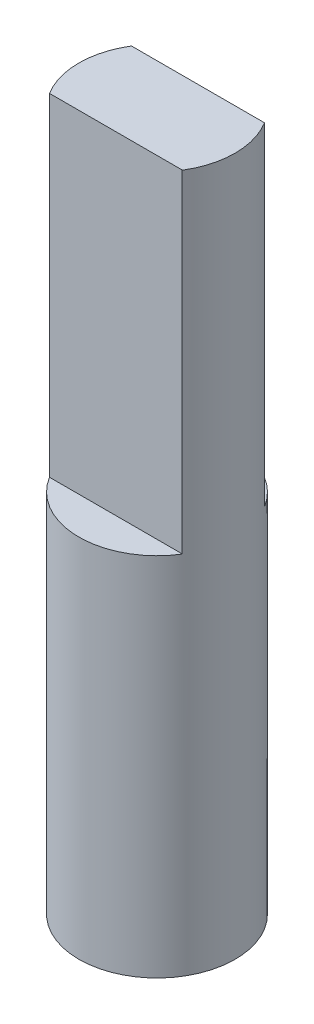
ISO-10303-21;
HEADER;
FILE_DESCRIPTION(('STEP AP214'),'2;1');
FILE_NAME('part.step','',(''),(''),'','','');
FILE_SCHEMA(('AUTOMOTIVE_DESIGN { 1 0 10303 214 1 1 1 1 }'));
ENDSEC;
DATA;
#1=APPLICATION_CONTEXT('core data for automotive mechanical design processes');
#2=APPLICATION_PROTOCOL_DEFINITION('international standard','automotive_design',2000,#1);
#3=PRODUCT_CONTEXT('',#1,'mechanical');
#4=PRODUCT('Part','Part','',(#3));
#5=PRODUCT_RELATED_PRODUCT_CATEGORY('part','',(#4));
#6=PRODUCT_DEFINITION_FORMATION('','',#4);
#7=PRODUCT_DEFINITION_CONTEXT('part definition',#1,'design');
#8=PRODUCT_DEFINITION('design','',#6,#7);
#9=PRODUCT_DEFINITION_SHAPE('','',#8);
#10=(LENGTH_UNIT() NAMED_UNIT(*) SI_UNIT(.MILLI.,.METRE.));
#11=(NAMED_UNIT(*) PLANE_ANGLE_UNIT() SI_UNIT($,.RADIAN.));
#12=(NAMED_UNIT(*) SI_UNIT($,.STERADIAN.) SOLID_ANGLE_UNIT());
#13=UNCERTAINTY_MEASURE_WITH_UNIT(LENGTH_MEASURE(1.E-05),#10,'distance_accuracy_value','');
#14=(GEOMETRIC_REPRESENTATION_CONTEXT(3) GLOBAL_UNCERTAINTY_ASSIGNED_CONTEXT((#13)) GLOBAL_UNIT_ASSIGNED_CONTEXT((#10,
#11,#12)) REPRESENTATION_CONTEXT('',''));
#15=CARTESIAN_POINT('',(0.,0.,0.));
#16=DIRECTION('',(0.,0.,1.));
#17=DIRECTION('',(1.,0.,0.));
#18=AXIS2_PLACEMENT_3D('',#15,#16,#17);
#19=CARTESIAN_POINT('',(0.,21.,0.));
#20=DIRECTION('',(0.,-1.,0.));
#21=DIRECTION('',(0.,0.,-1.));
#22=AXIS2_PLACEMENT_3D('',#19,#20,#21);
#23=CYLINDRICAL_SURFACE('',#22,2.35);
#24=CARTESIAN_POINT('',(0.,0.,0.));
#25=DIRECTION('',(0.,1.,0.));
#26=DIRECTION('',(0.,0.,1.));
#27=AXIS2_PLACEMENT_3D('',#24,#25,#26);
#28=CIRCLE('',#27,2.35);
#29=CARTESIAN_POINT('',(0.,0.,2.35));
#30=VERTEX_POINT('',#29);
#31=EDGE_CURVE('E122',#30,#30,#28,.T.);
#32=ORIENTED_EDGE('',*,*,#31,.T.);
#33=EDGE_LOOP('',(#32));
#34=FACE_BOUND('',#33,.T.);
#35=DIRECTION('',(0.,-1.,0.));
#36=VECTOR('',#35,1.);
#37=CARTESIAN_POINT('',(-2.,21.,1.23389626792531));
#38=LINE('',#37,#36);
#39=CARTESIAN_POINT('',(-2.,21.,1.23389626792531));
#40=VERTEX_POINT('',#39);
#41=CARTESIAN_POINT('',(-2.,11.,1.23389626792531));
#42=VERTEX_POINT('',#41);
#43=EDGE_CURVE('E94',#40,#42,#38,.T.);
#44=ORIENTED_EDGE('',*,*,#43,.F.);
#45=CARTESIAN_POINT('',(0.,21.,0.));
#46=DIRECTION('',(0.,1.,0.));
#47=DIRECTION('',(0.,0.,1.));
#48=AXIS2_PLACEMENT_3D('',#45,#46,#47);
#49=CIRCLE('',#48,2.35);
#50=CARTESIAN_POINT('',(-2.,21.,-1.23389626792531));
#51=VERTEX_POINT('',#50);
#52=EDGE_CURVE('E123',#51,#40,#49,.T.);
#53=ORIENTED_EDGE('',*,*,#52,.F.);
#54=DIRECTION('',(0.,-1.,0.));
#55=VECTOR('',#54,1.);
#56=CARTESIAN_POINT('',(-2.,21.,-1.23389626792531));
#57=LINE('',#56,#55);
#58=CARTESIAN_POINT('',(-2.,11.,-1.23389626792531));
#59=VERTEX_POINT('',#58);
#60=EDGE_CURVE('E119',#51,#59,#57,.T.);
#61=ORIENTED_EDGE('',*,*,#60,.T.);
#62=CARTESIAN_POINT('',(0.,11.,0.));
#63=DIRECTION('',(0.,1.,0.));
#64=DIRECTION('',(0.,0.,1.));
#65=AXIS2_PLACEMENT_3D('',#62,#63,#64);
#66=CIRCLE('',#65,2.35);
#67=CARTESIAN_POINT('',(1.99637354958509,11.,-1.23975507682648));
#68=VERTEX_POINT('',#67);
#69=EDGE_CURVE('E131',#68,#59,#66,.T.);
#70=ORIENTED_EDGE('',*,*,#69,.F.);
#71=DIRECTION('',(0.,-1.,0.));
#72=VECTOR('',#71,1.);
#73=CARTESIAN_POINT('',(1.99637354958509,21.,-1.23975507682648));
#74=LINE('',#73,#72);
#75=CARTESIAN_POINT('',(1.99637354958509,21.,-1.23975507682648));
#76=VERTEX_POINT('',#75);
#77=EDGE_CURVE('E116',#68,#76,#74,.F.);
#78=ORIENTED_EDGE('',*,*,#77,.T.);
#79=CARTESIAN_POINT('',(1.99637354958509,21.,1.23975507682648));
#80=VERTEX_POINT('',#79);
#81=EDGE_CURVE('E127',#80,#76,#49,.T.);
#82=ORIENTED_EDGE('',*,*,#81,.F.);
#83=DIRECTION('',(0.,-1.,0.));
#84=VECTOR('',#83,1.);
#85=CARTESIAN_POINT('',(1.99637354958509,21.,1.23975507682648));
#86=LINE('',#85,#84);
#87=CARTESIAN_POINT('',(1.99637354958509,11.,1.23975507682648));
#88=VERTEX_POINT('',#87);
#89=EDGE_CURVE('E47',#88,#80,#86,.F.);
#90=ORIENTED_EDGE('',*,*,#89,.F.);
#91=CARTESIAN_POINT('',(0.,11.,0.));
#92=DIRECTION('',(0.,1.,0.));
#93=DIRECTION('',(0.,0.,1.));
#94=AXIS2_PLACEMENT_3D('',#91,#92,#93);
#95=CIRCLE('',#94,2.35);
#96=EDGE_CURVE('E11',#42,#88,#95,.T.);
#97=ORIENTED_EDGE('',*,*,#96,.F.);
#98=EDGE_LOOP('',(#44,#53,#61,#70,#78,#82,#90,#97));
#99=FACE_BOUND('',#98,.T.);
#100=ADVANCED_FACE('F33',(#34,#99),#23,.T.);
#101=CARTESIAN_POINT('',(0.,21.,0.));
#102=DIRECTION('',(0.,1.,0.));
#103=DIRECTION('',(0.,0.,1.));
#104=AXIS2_PLACEMENT_3D('',#101,#102,#103);
#105=PLANE('',#104);
#106=ORIENTED_EDGE('',*,*,#52,.T.);
#107=DIRECTION('',(1.,0.,0.));
#108=VECTOR('',#107,1.);
#109=CARTESIAN_POINT('',(0.,21.,1.23389626792531));
#110=LINE('',#109,#108);
#111=CARTESIAN_POINT('',(1.99637354958509,21.,1.23389626792531));
#112=VERTEX_POINT('',#111);
#113=EDGE_CURVE('E40',#40,#112,#110,.T.);
#114=ORIENTED_EDGE('',*,*,#113,.T.);
#115=DIRECTION('',(0.,0.,1.));
#116=VECTOR('',#115,1.);
#117=CARTESIAN_POINT('',(1.99637354958509,21.,0.));
#118=LINE('',#117,#116);
#119=EDGE_CURVE('E98',#112,#80,#118,.T.);
#120=ORIENTED_EDGE('',*,*,#119,.T.);
#121=ORIENTED_EDGE('',*,*,#81,.T.);
#122=DIRECTION('',(0.,0.,-1.));
#123=VECTOR('',#122,1.);
#124=CARTESIAN_POINT('',(1.99637354958509,21.,0.));
#125=LINE('',#124,#123);
#126=CARTESIAN_POINT('',(1.99637354958509,21.,-1.23389626792531));
#127=VERTEX_POINT('',#126);
#128=EDGE_CURVE('E108',#127,#76,#125,.T.);
#129=ORIENTED_EDGE('',*,*,#128,.F.);
#130=DIRECTION('',(1.,0.,0.));
#131=VECTOR('',#130,1.);
#132=CARTESIAN_POINT('',(0.,21.,-1.23389626792531));
#133=LINE('',#132,#131);
#134=EDGE_CURVE('E126',#51,#127,#133,.T.);
#135=ORIENTED_EDGE('',*,*,#134,.F.);
#136=EDGE_LOOP('',(#106,#114,#120,#121,#129,#135));
#137=FACE_BOUND('',#136,.T.);
#138=ADVANCED_FACE('F133',(#137),#105,.T.);
#139=CARTESIAN_POINT('',(0.,0.,0.));
#140=DIRECTION('',(0.,1.,0.));
#141=DIRECTION('',(0.,0.,1.));
#142=AXIS2_PLACEMENT_3D('',#139,#140,#141);
#143=PLANE('',#142);
#144=ORIENTED_EDGE('',*,*,#31,.F.);
#145=EDGE_LOOP('',(#144));
#146=FACE_BOUND('',#145,.T.);
#147=ADVANCED_FACE('F153',(#146),#143,.F.);
#148=CARTESIAN_POINT('',(0.,11.,0.));
#149=DIRECTION('',(0.,1.,0.));
#150=DIRECTION('',(0.,0.,1.));
#151=AXIS2_PLACEMENT_3D('',#148,#149,#150);
#152=PLANE('',#151);
#153=ORIENTED_EDGE('',*,*,#69,.T.);
#154=DIRECTION('',(1.,0.,0.));
#155=VECTOR('',#154,1.);
#156=CARTESIAN_POINT('',(0.,11.,-1.23389626792531));
#157=LINE('',#156,#155);
#158=CARTESIAN_POINT('',(1.99637354958509,11.,-1.23389626792531));
#159=VERTEX_POINT('',#158);
#160=EDGE_CURVE('E109',#59,#159,#157,.T.);
#161=ORIENTED_EDGE('',*,*,#160,.T.);
#162=DIRECTION('',(0.,0.,-1.));
#163=VECTOR('',#162,1.);
#164=CARTESIAN_POINT('',(1.99637354958509,11.,0.));
#165=LINE('',#164,#163);
#166=EDGE_CURVE('E111',#159,#68,#165,.T.);
#167=ORIENTED_EDGE('',*,*,#166,.T.);
#168=EDGE_LOOP('',(#153,#161,#167));
#169=FACE_BOUND('',#168,.T.);
#170=ADVANCED_FACE('F142',(#169),#152,.T.);
#171=CARTESIAN_POINT('',(0.,11.,-1.23389626792531));
#172=DIRECTION('',(0.,0.,1.));
#173=DIRECTION('',(1.,0.,0.));
#174=AXIS2_PLACEMENT_3D('',#171,#172,#173);
#175=PLANE('',#174);
#176=ORIENTED_EDGE('',*,*,#134,.T.);
#177=DIRECTION('',(0.,1.,0.));
#178=VECTOR('',#177,1.);
#179=CARTESIAN_POINT('',(1.99637354958509,11.,-1.23389626792531));
#180=LINE('',#179,#178);
#181=EDGE_CURVE('E55',#159,#127,#180,.T.);
#182=ORIENTED_EDGE('',*,*,#181,.F.);
#183=ORIENTED_EDGE('',*,*,#160,.F.);
#184=ORIENTED_EDGE('',*,*,#60,.F.);
#185=EDGE_LOOP('',(#176,#182,#183,#184));
#186=FACE_BOUND('',#185,.T.);
#187=ADVANCED_FACE('F145',(#186),#175,.F.);
#188=CARTESIAN_POINT('',(1.99637354958509,11.,0.));
#189=DIRECTION('',(1.,0.,0.));
#190=DIRECTION('',(0.,0.,-1.));
#191=AXIS2_PLACEMENT_3D('',#188,#189,#190);
#192=PLANE('',#191);
#193=ORIENTED_EDGE('',*,*,#166,.F.);
#194=ORIENTED_EDGE('',*,*,#181,.T.);
#195=ORIENTED_EDGE('',*,*,#128,.T.);
#196=ORIENTED_EDGE('',*,*,#77,.F.);
#197=EDGE_LOOP('',(#193,#194,#195,#196));
#198=FACE_BOUND('',#197,.T.);
#199=ADVANCED_FACE('F140',(#198),#192,.F.);
#200=CARTESIAN_POINT('',(0.,11.,0.));
#201=DIRECTION('',(0.,1.,0.));
#202=DIRECTION('',(0.,0.,1.));
#203=AXIS2_PLACEMENT_3D('',#200,#201,#202);
#204=PLANE('',#203);
#205=ORIENTED_EDGE('',*,*,#96,.T.);
#206=DIRECTION('',(0.,0.,1.));
#207=VECTOR('',#206,1.);
#208=CARTESIAN_POINT('',(1.99637354958509,11.,0.));
#209=LINE('',#208,#207);
#210=CARTESIAN_POINT('',(1.99637354958509,11.,1.23389626792531));
#211=VERTEX_POINT('',#210);
#212=EDGE_CURVE('E97',#211,#88,#209,.T.);
#213=ORIENTED_EDGE('',*,*,#212,.F.);
#214=DIRECTION('',(1.,0.,0.));
#215=VECTOR('',#214,1.);
#216=CARTESIAN_POINT('',(0.,11.,1.23389626792531));
#217=LINE('',#216,#215);
#218=EDGE_CURVE('E87',#42,#211,#217,.T.);
#219=ORIENTED_EDGE('',*,*,#218,.F.);
#220=EDGE_LOOP('',(#205,#213,#219));
#221=FACE_BOUND('',#220,.T.);
#222=ADVANCED_FACE('F100',(#221),#204,.T.);
#223=CARTESIAN_POINT('',(0.,11.,1.23389626792531));
#224=DIRECTION('',(0.,0.,1.));
#225=DIRECTION('',(1.,0.,0.));
#226=AXIS2_PLACEMENT_3D('',#223,#224,#225);
#227=PLANE('',#226);
#228=ORIENTED_EDGE('',*,*,#43,.T.);
#229=ORIENTED_EDGE('',*,*,#218,.T.);
#230=DIRECTION('',(0.,1.,0.));
#231=VECTOR('',#230,1.);
#232=CARTESIAN_POINT('',(1.99637354958509,11.,1.23389626792531));
#233=LINE('',#232,#231);
#234=EDGE_CURVE('E91',#211,#112,#233,.T.);
#235=ORIENTED_EDGE('',*,*,#234,.T.);
#236=ORIENTED_EDGE('',*,*,#113,.F.);
#237=EDGE_LOOP('',(#228,#229,#235,#236));
#238=FACE_BOUND('',#237,.T.);
#239=ADVANCED_FACE('F89',(#238),#227,.T.);
#240=CARTESIAN_POINT('',(1.99637354958509,11.,0.));
#241=DIRECTION('',(-1.,0.,0.));
#242=DIRECTION('',(0.,0.,1.));
#243=AXIS2_PLACEMENT_3D('',#240,#241,#242);
#244=PLANE('',#243);
#245=ORIENTED_EDGE('',*,*,#89,.T.);
#246=ORIENTED_EDGE('',*,*,#119,.F.);
#247=ORIENTED_EDGE('',*,*,#234,.F.);
#248=ORIENTED_EDGE('',*,*,#212,.T.);
#249=EDGE_LOOP('',(#245,#246,#247,#248));
#250=FACE_BOUND('',#249,.T.);
#251=ADVANCED_FACE('F102',(#250),#244,.T.);
#252=CLOSED_SHELL('',(#100,#138,#147,#170,#187,#199,#222,#239,#251));
#253=MANIFOLD_SOLID_BREP('B2',#252);
#254=ADVANCED_BREP_SHAPE_REPRESENTATION('',(#18,#253),#14);
#255=SHAPE_DEFINITION_REPRESENTATION(#9,#254);
ENDSEC;
END-ISO-10303-21;
